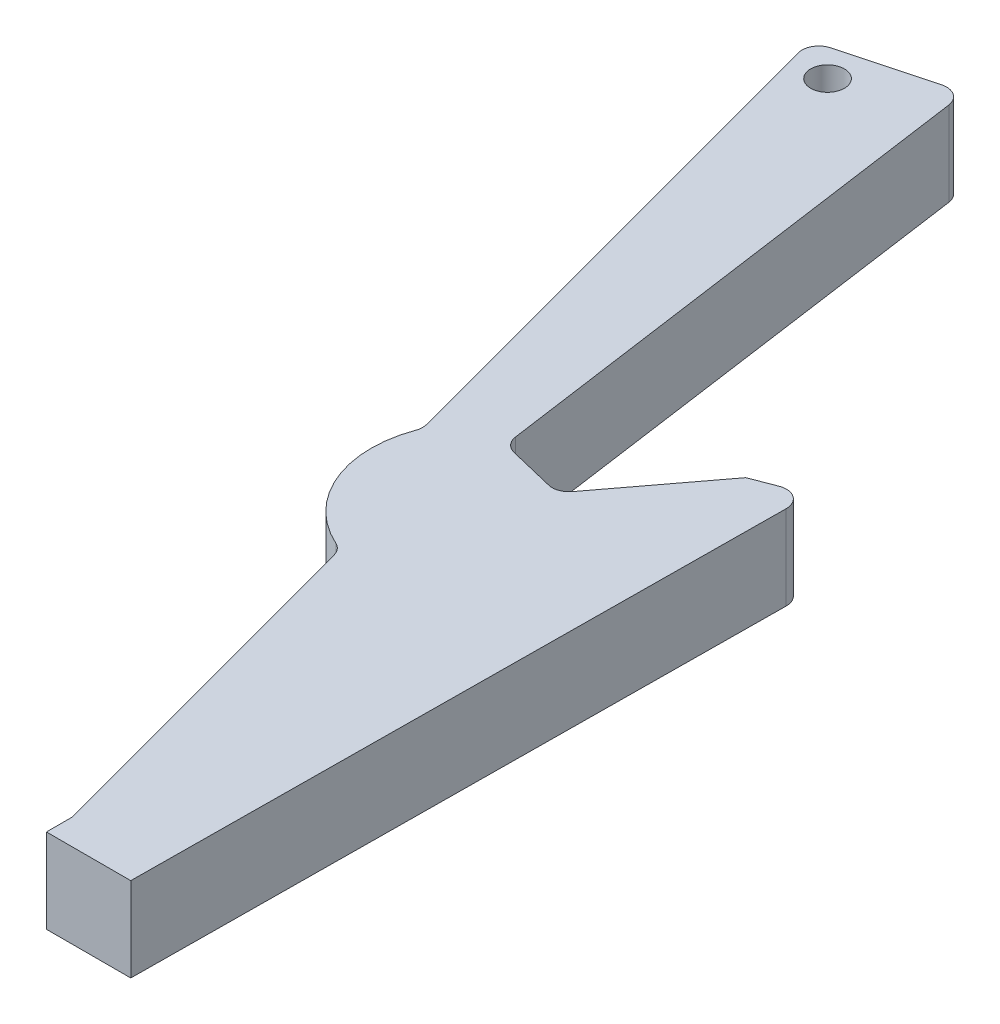
ISO-10303-21;
HEADER;
FILE_DESCRIPTION(('STEP AP214'),'2;1');
FILE_NAME('part.step','',(''),(''),'','','');
FILE_SCHEMA(('AUTOMOTIVE_DESIGN { 1 0 10303 214 1 1 1 1 }'));
ENDSEC;
DATA;
#1=APPLICATION_CONTEXT('core data for automotive mechanical design processes');
#2=APPLICATION_PROTOCOL_DEFINITION('international standard','automotive_design',2000,#1);
#3=PRODUCT_CONTEXT('',#1,'mechanical');
#4=PRODUCT('Part','Part','',(#3));
#5=PRODUCT_RELATED_PRODUCT_CATEGORY('part','',(#4));
#6=PRODUCT_DEFINITION_FORMATION('','',#4);
#7=PRODUCT_DEFINITION_CONTEXT('part definition',#1,'design');
#8=PRODUCT_DEFINITION('design','',#6,#7);
#9=PRODUCT_DEFINITION_SHAPE('','',#8);
#10=(LENGTH_UNIT() NAMED_UNIT(*) SI_UNIT(.MILLI.,.METRE.));
#11=(NAMED_UNIT(*) PLANE_ANGLE_UNIT() SI_UNIT($,.RADIAN.));
#12=(NAMED_UNIT(*) SI_UNIT($,.STERADIAN.) SOLID_ANGLE_UNIT());
#13=UNCERTAINTY_MEASURE_WITH_UNIT(LENGTH_MEASURE(1.E-05),#10,'distance_accuracy_value','');
#14=(GEOMETRIC_REPRESENTATION_CONTEXT(3) GLOBAL_UNCERTAINTY_ASSIGNED_CONTEXT((#13)) GLOBAL_UNIT_ASSIGNED_CONTEXT((#10,
#11,#12)) REPRESENTATION_CONTEXT('',''));
#15=CARTESIAN_POINT('',(0.,0.,0.));
#16=DIRECTION('',(0.,0.,1.));
#17=DIRECTION('',(1.,0.,0.));
#18=AXIS2_PLACEMENT_3D('',#15,#16,#17);
#19=CARTESIAN_POINT('',(4.49028515077188,10.,-86.0590658013581));
#20=DIRECTION('',(-0.99026806874157,0.,0.13917310096007));
#21=DIRECTION('',(0.13917310096007,0.,0.99026806874157));
#22=AXIS2_PLACEMENT_3D('',#19,#20,#21);
#23=PLANE('',#22);
#24=DIRECTION('',(-0.13917310096007,0.,-0.99026806874157));
#25=VECTOR('',#24,1.);
#26=CARTESIAN_POINT('',(4.49028515077188,10.,-86.0590658013581));
#27=LINE('',#26,#25);
#28=CARTESIAN_POINT('',(13.2081072924992,10.,-24.028538088983));
#29=VERTEX_POINT('',#28);
#30=CARTESIAN_POINT('',(4.80489830026733,10.,-83.8204769231744));
#31=VERTEX_POINT('',#30);
#32=EDGE_CURVE('E261',#29,#31,#27,.T.);
#33=ORIENTED_EDGE('',*,*,#32,.F.);
#34=DIRECTION('',(0.,-1.,0.));
#35=VECTOR('',#34,1.);
#36=CARTESIAN_POINT('',(13.2081072924992,0.,-24.028538088983));
#37=LINE('',#36,#35);
#38=CARTESIAN_POINT('',(13.2081072924992,0.,-24.028538088983));
#39=VERTEX_POINT('',#38);
#40=EDGE_CURVE('E290',#29,#39,#37,.T.);
#41=ORIENTED_EDGE('',*,*,#40,.T.);
#42=DIRECTION('',(-0.13917310096007,0.,-0.99026806874157));
#43=VECTOR('',#42,1.);
#44=CARTESIAN_POINT('',(4.49028515077188,0.,-86.0590658013581));
#45=LINE('',#44,#43);
#46=CARTESIAN_POINT('',(4.80489830026733,0.,-83.8204769231744));
#47=VERTEX_POINT('',#46);
#48=EDGE_CURVE('E222',#39,#47,#45,.T.);
#49=ORIENTED_EDGE('',*,*,#48,.T.);
#50=DIRECTION('',(0.,-1.,0.));
#51=VECTOR('',#50,1.);
#52=CARTESIAN_POINT('',(4.80489830026733,10.,-83.8204769231744));
#53=LINE('',#52,#51);
#54=EDGE_CURVE('E287',#47,#31,#53,.F.);
#55=ORIENTED_EDGE('',*,*,#54,.T.);
#56=EDGE_LOOP('',(#33,#41,#49,#55));
#57=FACE_BOUND('',#56,.T.);
#58=ADVANCED_FACE('F45',(#57),#23,.F.);
#59=CARTESIAN_POINT('',(4.49028515077188,10.,-86.0590658013581));
#60=DIRECTION('',(0.258819045102522,0.,0.965925826289068));
#61=DIRECTION('',(0.965925826289068,0.,-0.258819045102522));
#62=AXIS2_PLACEMENT_3D('',#59,#60,#61);
#63=PLANE('',#62);
#64=DIRECTION('',(-0.965925826289068,0.,0.258819045102522));
#65=VECTOR('',#64,1.);
#66=CARTESIAN_POINT('',(4.49028515077188,10.,-86.0590658013581));
#67=LINE('',#66,#65);
#68=CARTESIAN_POINT('',(2.30672407257914,10.,-85.4739823738324));
#69=VERTEX_POINT('',#68);
#70=CARTESIAN_POINT('',(-8.066750590986,10.,-82.6944182150254));
#71=VERTEX_POINT('',#70);
#72=EDGE_CURVE('E378',#69,#71,#67,.T.);
#73=ORIENTED_EDGE('',*,*,#72,.F.);
#74=DIRECTION('',(0.,-1.,0.));
#75=VECTOR('',#74,1.);
#76=CARTESIAN_POINT('',(2.30672407257914,10.,-85.4739823738324));
#77=LINE('',#76,#75);
#78=CARTESIAN_POINT('',(2.30672407257914,0.,-85.4739823738324));
#79=VERTEX_POINT('',#78);
#80=EDGE_CURVE('E330',#69,#79,#77,.T.);
#81=ORIENTED_EDGE('',*,*,#80,.T.);
#82=DIRECTION('',(-0.965925826289068,0.,0.258819045102522));
#83=VECTOR('',#82,1.);
#84=CARTESIAN_POINT('',(4.49028515077188,0.,-86.0590658013581));
#85=LINE('',#84,#83);
#86=CARTESIAN_POINT('',(-8.066750590986,0.,-82.6944182150254));
#87=VERTEX_POINT('',#86);
#88=EDGE_CURVE('E226',#79,#87,#85,.T.);
#89=ORIENTED_EDGE('',*,*,#88,.T.);
#90=DIRECTION('',(0.,-1.,0.));
#91=VECTOR('',#90,1.);
#92=CARTESIAN_POINT('',(-8.066750590986,10.,-82.6944182150254));
#93=LINE('',#92,#91);
#94=EDGE_CURVE('E61',#87,#71,#93,.F.);
#95=ORIENTED_EDGE('',*,*,#94,.T.);
#96=EDGE_LOOP('',(#73,#81,#89,#95));
#97=FACE_BOUND('',#96,.T.);
#98=ADVANCED_FACE('F424',(#97),#63,.F.);
#99=CARTESIAN_POINT('',(-9.99860224356414,10.,-82.1767801248203));
#100=DIRECTION('',(0.965925826289067,0.,-0.258819045102525));
#101=DIRECTION('',(-0.258819045102525,0.,-0.965925826289067));
#102=AXIS2_PLACEMENT_3D('',#99,#100,#101);
#103=PLANE('',#102);
#104=DIRECTION('',(0.258819045102525,0.,0.965925826289067));
#105=VECTOR('',#104,1.);
#106=CARTESIAN_POINT('',(-9.99860224356414,0.,-82.1767801248203));
#107=LINE('',#106,#105);
#108=CARTESIAN_POINT('',(-9.48096415335909,0.,-80.2449284722422));
#109=VERTEX_POINT('',#108);
#110=CARTESIAN_POINT('',(6.65382916204913,0.,-20.0290600495171));
#111=VERTEX_POINT('',#110);
#112=EDGE_CURVE('E230',#109,#111,#107,.T.);
#113=ORIENTED_EDGE('',*,*,#112,.T.);
#114=DIRECTION('',(0.,1.,0.));
#115=VECTOR('',#114,1.);
#116=CARTESIAN_POINT('',(6.65382916204914,10.,-20.0290600495171));
#117=LINE('',#116,#115);
#118=CARTESIAN_POINT('',(6.65382916204913,10.,-20.0290600495171));
#119=VERTEX_POINT('',#118);
#120=EDGE_CURVE('E284',#111,#119,#117,.T.);
#121=ORIENTED_EDGE('',*,*,#120,.T.);
#122=DIRECTION('',(0.258819045102525,0.,0.965925826289067));
#123=VECTOR('',#122,1.);
#124=CARTESIAN_POINT('',(-9.99860224356414,10.,-82.1767801248203));
#125=LINE('',#124,#123);
#126=CARTESIAN_POINT('',(-9.48096415335909,10.,-80.2449284722422));
#127=VERTEX_POINT('',#126);
#128=EDGE_CURVE('E381',#127,#119,#125,.T.);
#129=ORIENTED_EDGE('',*,*,#128,.F.);
#130=DIRECTION('',(0.,-1.,0.));
#131=VECTOR('',#130,1.);
#132=CARTESIAN_POINT('',(-9.48096415335909,10.,-80.2449284722422));
#133=LINE('',#132,#131);
#134=EDGE_CURVE('E280',#127,#109,#133,.T.);
#135=ORIENTED_EDGE('',*,*,#134,.T.);
#136=EDGE_LOOP('',(#113,#121,#129,#135));
#137=FACE_BOUND('',#136,.T.);
#138=ADVANCED_FACE('F430',(#137),#103,.F.);
#139=CARTESIAN_POINT('',(18.7978009355206,10.,-14.3276786324609));
#140=DIRECTION('',(0.,-1.,0.));
#141=DIRECTION('',(0.,0.,-1.));
#142=AXIS2_PLACEMENT_3D('',#139,#140,#141);
#143=CYLINDRICAL_SURFACE('',#142,13.);
#144=CARTESIAN_POINT('',(18.7978009355206,0.,-14.3276786324609));
#145=DIRECTION('',(0.,1.,0.));
#146=DIRECTION('',(0.,0.,1.));
#147=AXIS2_PLACEMENT_3D('',#144,#145,#146);
#148=CIRCLE('',#147,13.);
#149=CARTESIAN_POINT('',(6.59875396627762,0.,-18.8202561823986));
#150=VERTEX_POINT('',#149);
#151=CARTESIAN_POINT('',(13.4555984216238,0.,-2.47605965864496));
#152=VERTEX_POINT('',#151);
#153=EDGE_CURVE('E234',#150,#152,#148,.T.);
#154=ORIENTED_EDGE('',*,*,#153,.T.);
#155=DIRECTION('',(0.,-1.,0.));
#156=VECTOR('',#155,1.);
#157=CARTESIAN_POINT('',(13.4555984216238,10.,-2.47605965864496));
#158=LINE('',#157,#156);
#159=CARTESIAN_POINT('',(13.4555984216238,10.,-2.47605965864496));
#160=VERTEX_POINT('',#159);
#161=EDGE_CURVE('E277',#152,#160,#158,.F.);
#162=ORIENTED_EDGE('',*,*,#161,.T.);
#163=CARTESIAN_POINT('',(18.7978009355206,10.,-14.3276786324609));
#164=DIRECTION('',(0.,1.,0.));
#165=DIRECTION('',(0.,0.,1.));
#166=AXIS2_PLACEMENT_3D('',#163,#164,#165);
#167=CIRCLE('',#166,13.);
#168=CARTESIAN_POINT('',(6.59875396627762,10.,-18.8202561823986));
#169=VERTEX_POINT('',#168);
#170=EDGE_CURVE('E184',#169,#160,#167,.T.);
#171=ORIENTED_EDGE('',*,*,#170,.F.);
#172=DIRECTION('',(0.,-1.,0.));
#173=VECTOR('',#172,1.);
#174=CARTESIAN_POINT('',(6.59875396627762,10.,-18.8202561823986));
#175=LINE('',#174,#173);
#176=EDGE_CURVE('E273',#169,#150,#175,.T.);
#177=ORIENTED_EDGE('',*,*,#176,.T.);
#178=EDGE_LOOP('',(#154,#162,#171,#177));
#179=FACE_BOUND('',#178,.T.);
#180=ADVANCED_FACE('F461',(#179),#143,.T.);
#181=CARTESIAN_POINT('',(25.9560570340894,10.,41.3394942645224));
#182=DIRECTION('',(0.965925826289068,0.,-0.258819045102522));
#183=DIRECTION('',(-0.258819045102522,0.,-0.965925826289068));
#184=AXIS2_PLACEMENT_3D('',#181,#182,#183);
#185=PLANE('',#184);
#186=DIRECTION('',(0.258819045102522,0.,0.965925826289068));
#187=VECTOR('',#186,1.);
#188=CARTESIAN_POINT('',(25.9560570340894,10.,41.3394942645224));
#189=LINE('',#188,#187);
#190=CARTESIAN_POINT('',(14.5655727643716,10.,-1.1703717528783));
#191=VERTEX_POINT('',#190);
#192=CARTESIAN_POINT('',(25.9560570340894,10.,41.3394942645224));
#193=VERTEX_POINT('',#192);
#194=EDGE_CURVE('E170',#191,#193,#189,.T.);
#195=ORIENTED_EDGE('',*,*,#194,.F.);
#196=DIRECTION('',(0.,1.,0.));
#197=VECTOR('',#196,1.);
#198=CARTESIAN_POINT('',(14.5655727643716,0.,-1.17037175287832));
#199=LINE('',#198,#197);
#200=CARTESIAN_POINT('',(14.5655727643716,0.,-1.1703717528783));
#201=VERTEX_POINT('',#200);
#202=EDGE_CURVE('E194',#191,#201,#199,.F.);
#203=ORIENTED_EDGE('',*,*,#202,.T.);
#204=DIRECTION('',(0.258819045102522,0.,0.965925826289068));
#205=VECTOR('',#204,1.);
#206=CARTESIAN_POINT('',(25.9560570340894,0.,41.3394942645224));
#207=LINE('',#206,#205);
#208=CARTESIAN_POINT('',(25.9560570340894,0.,41.3394942645224));
#209=VERTEX_POINT('',#208);
#210=EDGE_CURVE('E190',#201,#209,#207,.T.);
#211=ORIENTED_EDGE('',*,*,#210,.T.);
#212=DIRECTION('',(0.,-1.,0.));
#213=VECTOR('',#212,1.);
#214=CARTESIAN_POINT('',(25.9560570340894,10.,41.3394942645224));
#215=LINE('',#214,#213);
#216=EDGE_CURVE('E187',#193,#209,#215,.T.);
#217=ORIENTED_EDGE('',*,*,#216,.F.);
#218=EDGE_LOOP('',(#195,#203,#211,#217));
#219=FACE_BOUND('',#218,.T.);
#220=ADVANCED_FACE('F188',(#219),#185,.F.);
#221=CARTESIAN_POINT('',(25.9560570340894,10.,44.3394942645224));
#222=DIRECTION('',(1.,0.,0.));
#223=DIRECTION('',(0.,0.,-1.));
#224=AXIS2_PLACEMENT_3D('',#221,#222,#223);
#225=PLANE('',#224);
#226=DIRECTION('',(0.,0.,1.));
#227=VECTOR('',#226,1.);
#228=CARTESIAN_POINT('',(25.9560570340894,0.,44.3394942645224));
#229=LINE('',#228,#227);
#230=CARTESIAN_POINT('',(25.9560570340894,0.,44.3394942645224));
#231=VERTEX_POINT('',#230);
#232=EDGE_CURVE('E240',#209,#231,#229,.T.);
#233=ORIENTED_EDGE('',*,*,#232,.T.);
#234=DIRECTION('',(0.,-1.,0.));
#235=VECTOR('',#234,1.);
#236=CARTESIAN_POINT('',(25.9560570340894,10.,44.3394942645224));
#237=LINE('',#236,#235);
#238=CARTESIAN_POINT('',(25.9560570340894,10.,44.3394942645224));
#239=VERTEX_POINT('',#238);
#240=EDGE_CURVE('E195',#239,#231,#237,.T.);
#241=ORIENTED_EDGE('',*,*,#240,.F.);
#242=DIRECTION('',(0.,0.,1.));
#243=VECTOR('',#242,1.);
#244=CARTESIAN_POINT('',(25.9560570340894,10.,44.3394942645224));
#245=LINE('',#244,#243);
#246=EDGE_CURVE('E175',#193,#239,#245,.T.);
#247=ORIENTED_EDGE('',*,*,#246,.F.);
#248=ORIENTED_EDGE('',*,*,#216,.T.);
#249=EDGE_LOOP('',(#233,#241,#247,#248));
#250=FACE_BOUND('',#249,.T.);
#251=ADVANCED_FACE('F197',(#250),#225,.F.);
#252=CARTESIAN_POINT('',(35.9560570340894,10.,44.3394942645224));
#253=DIRECTION('',(0.,0.,-1.));
#254=DIRECTION('',(-1.,0.,0.));
#255=AXIS2_PLACEMENT_3D('',#252,#253,#254);
#256=PLANE('',#255);
#257=DIRECTION('',(1.,0.,0.));
#258=VECTOR('',#257,1.);
#259=CARTESIAN_POINT('',(35.9560570340894,0.,44.3394942645224));
#260=LINE('',#259,#258);
#261=CARTESIAN_POINT('',(35.9560570340894,0.,44.3394942645224));
#262=VERTEX_POINT('',#261);
#263=EDGE_CURVE('E243',#231,#262,#260,.T.);
#264=ORIENTED_EDGE('',*,*,#263,.T.);
#265=DIRECTION('',(0.,-1.,0.));
#266=VECTOR('',#265,1.);
#267=CARTESIAN_POINT('',(35.9560570340894,10.,44.3394942645224));
#268=LINE('',#267,#266);
#269=CARTESIAN_POINT('',(35.9560570340894,10.,44.3394942645224));
#270=VERTEX_POINT('',#269);
#271=EDGE_CURVE('E265',#270,#262,#268,.T.);
#272=ORIENTED_EDGE('',*,*,#271,.F.);
#273=DIRECTION('',(1.,0.,0.));
#274=VECTOR('',#273,1.);
#275=CARTESIAN_POINT('',(35.9560570340894,10.,44.3394942645224));
#276=LINE('',#275,#274);
#277=EDGE_CURVE('E201',#239,#270,#276,.T.);
#278=ORIENTED_EDGE('',*,*,#277,.F.);
#279=ORIENTED_EDGE('',*,*,#240,.T.);
#280=EDGE_LOOP('',(#264,#272,#278,#279));
#281=FACE_BOUND('',#280,.T.);
#282=ADVANCED_FACE('F401',(#281),#256,.F.);
#283=CARTESIAN_POINT('',(36.6450825246778,10.,-35.6605057354776));
#284=DIRECTION('',(-0.999962911741013,0.,-0.00861249919790591));
#285=DIRECTION('',(-0.00861249919790591,0.,0.999962911741014));
#286=AXIS2_PLACEMENT_3D('',#283,#284,#285);
#287=PLANE('',#286);
#288=DIRECTION('',(0.00861249919790591,0.,-0.999962911741013));
#289=VECTOR('',#288,1.);
#290=CARTESIAN_POINT('',(36.6450825246778,0.,-35.6605057354776));
#291=LINE('',#290,#289);
#292=CARTESIAN_POINT('',(36.6198231144349,0.,-32.7277364155751));
#293=VERTEX_POINT('',#292);
#294=EDGE_CURVE('E246',#262,#293,#291,.T.);
#295=ORIENTED_EDGE('',*,*,#294,.T.);
#296=DIRECTION('',(0.,-1.,0.));
#297=VECTOR('',#296,1.);
#298=CARTESIAN_POINT('',(36.6198231144349,10.,-32.7277364155751));
#299=LINE('',#298,#297);
#300=CARTESIAN_POINT('',(36.6198231144349,10.,-32.7277364155751));
#301=VERTEX_POINT('',#300);
#302=EDGE_CURVE('E317',#293,#301,#299,.F.);
#303=ORIENTED_EDGE('',*,*,#302,.T.);
#304=DIRECTION('',(0.00861249919790591,0.,-0.999962911741013));
#305=VECTOR('',#304,1.);
#306=CARTESIAN_POINT('',(36.6450825246778,10.,-35.6605057354776));
#307=LINE('',#306,#305);
#308=EDGE_CURVE('E204',#270,#301,#307,.T.);
#309=ORIENTED_EDGE('',*,*,#308,.F.);
#310=ORIENTED_EDGE('',*,*,#271,.T.);
#311=EDGE_LOOP('',(#295,#303,#309,#310));
#312=FACE_BOUND('',#311,.T.);
#313=ADVANCED_FACE('F413',(#312),#287,.F.);
#314=CARTESIAN_POINT('',(31.0407715155712,10.,-33.5176809378781));
#315=DIRECTION('',(0.35713746626659,0.,0.934051834851086));
#316=DIRECTION('',(0.934051834851086,0.,-0.35713746626659));
#317=AXIS2_PLACEMENT_3D('',#314,#315,#316);
#318=PLANE('',#317);
#319=DIRECTION('',(-0.934051834851086,0.,0.35713746626659));
#320=VECTOR('',#319,1.);
#321=CARTESIAN_POINT('',(31.0407715155712,10.,-33.5176809378781));
#322=LINE('',#321,#320);
#323=CARTESIAN_POINT('',(33.9056223584197,10.,-34.6130650836731));
#324=VERTEX_POINT('',#323);
#325=CARTESIAN_POINT('',(31.0407715155712,10.,-33.5176809378781));
#326=VERTEX_POINT('',#325);
#327=EDGE_CURVE('E210',#324,#326,#322,.T.);
#328=ORIENTED_EDGE('',*,*,#327,.F.);
#329=DIRECTION('',(0.,-1.,0.));
#330=VECTOR('',#329,1.);
#331=CARTESIAN_POINT('',(33.9056223584197,10.,-34.6130650836731));
#332=LINE('',#331,#330);
#333=CARTESIAN_POINT('',(33.9056223584197,0.,-34.6130650836731));
#334=VERTEX_POINT('',#333);
#335=EDGE_CURVE('E304',#324,#334,#332,.T.);
#336=ORIENTED_EDGE('',*,*,#335,.T.);
#337=DIRECTION('',(-0.934051834851086,0.,0.35713746626659));
#338=VECTOR('',#337,1.);
#339=CARTESIAN_POINT('',(31.0407715155712,0.,-33.5176809378781));
#340=LINE('',#339,#338);
#341=CARTESIAN_POINT('',(31.0407715155712,0.,-33.5176809378781));
#342=VERTEX_POINT('',#341);
#343=EDGE_CURVE('E250',#334,#342,#340,.T.);
#344=ORIENTED_EDGE('',*,*,#343,.T.);
#345=DIRECTION('',(0.,-1.,0.));
#346=VECTOR('',#345,1.);
#347=CARTESIAN_POINT('',(31.0407715155712,10.,-33.5176809378781));
#348=LINE('',#347,#346);
#349=EDGE_CURVE('E221',#326,#342,#348,.T.);
#350=ORIENTED_EDGE('',*,*,#349,.F.);
#351=EDGE_LOOP('',(#328,#336,#344,#350));
#352=FACE_BOUND('',#351,.T.);
#353=ADVANCED_FACE('F412',(#352),#318,.F.);
#354=CARTESIAN_POINT('',(21.3973636122163,10.,-20.7503521644223));
#355=DIRECTION('',(0.797958048340987,0.,0.602712993959682));
#356=DIRECTION('',(0.602712993959682,0.,-0.797958048340987));
#357=AXIS2_PLACEMENT_3D('',#354,#355,#356);
#358=PLANE('',#357);
#359=DIRECTION('',(-0.602712993959682,0.,0.797958048340987));
#360=VECTOR('',#359,1.);
#361=CARTESIAN_POINT('',(21.3973636122163,0.,-20.7503521644223));
#362=LINE('',#361,#360);
#363=CARTESIAN_POINT('',(22.1878187573279,0.,-21.7968702438658));
#364=VERTEX_POINT('',#363);
#365=EDGE_CURVE('E253',#342,#364,#362,.T.);
#366=ORIENTED_EDGE('',*,*,#365,.T.);
#367=DIRECTION('',(0.,-1.,0.));
#368=VECTOR('',#367,1.);
#369=CARTESIAN_POINT('',(22.1878187573279,10.,-21.7968702438658));
#370=LINE('',#369,#368);
#371=CARTESIAN_POINT('',(22.1878187573279,10.,-21.7968702438658));
#372=VERTEX_POINT('',#371);
#373=EDGE_CURVE('E301',#364,#372,#370,.F.);
#374=ORIENTED_EDGE('',*,*,#373,.T.);
#375=DIRECTION('',(-0.602712993959682,0.,0.797958048340987));
#376=VECTOR('',#375,1.);
#377=CARTESIAN_POINT('',(21.3973636122163,10.,-20.7503521644223));
#378=LINE('',#377,#376);
#379=EDGE_CURVE('E213',#326,#372,#378,.T.);
#380=ORIENTED_EDGE('',*,*,#379,.F.);
#381=ORIENTED_EDGE('',*,*,#349,.T.);
#382=EDGE_LOOP('',(#366,#374,#380,#381));
#383=FACE_BOUND('',#382,.T.);
#384=ADVANCED_FACE('F360',(#383),#358,.F.);
#385=CARTESIAN_POINT('',(13.3973636122163,10.,-22.6819094018977));
#386=DIRECTION('',(-0.234700554659464,0.,0.972067718650578));
#387=DIRECTION('',(0.972067718650578,0.,0.234700554659464));
#388=AXIS2_PLACEMENT_3D('',#385,#386,#387);
#389=PLANE('',#388);
#390=DIRECTION('',(-0.972067718650578,0.,-0.234700554659464));
#391=VECTOR('',#390,1.);
#392=CARTESIAN_POINT('',(13.3973636122163,0.,-22.6819094018977));
#393=LINE('',#392,#391);
#394=CARTESIAN_POINT('',(20.122501551327,0.,-21.058160794484));
#395=VERTEX_POINT('',#394);
#396=CARTESIAN_POINT('',(14.7192423206634,0.,-22.362748853602));
#397=VERTEX_POINT('',#396);
#398=EDGE_CURVE('E257',#395,#397,#393,.T.);
#399=ORIENTED_EDGE('',*,*,#398,.T.);
#400=DIRECTION('',(0.,-1.,0.));
#401=VECTOR('',#400,1.);
#402=CARTESIAN_POINT('',(14.7192423206634,10.,-22.362748853602));
#403=LINE('',#402,#401);
#404=CARTESIAN_POINT('',(14.7192423206634,10.,-22.362748853602));
#405=VERTEX_POINT('',#404);
#406=EDGE_CURVE('E298',#397,#405,#403,.F.);
#407=ORIENTED_EDGE('',*,*,#406,.T.);
#408=DIRECTION('',(-0.972067718650578,0.,-0.234700554659464));
#409=VECTOR('',#408,1.);
#410=CARTESIAN_POINT('',(13.3973636122163,10.,-22.6819094018977));
#411=LINE('',#410,#409);
#412=CARTESIAN_POINT('',(20.122501551327,10.,-21.058160794484));
#413=VERTEX_POINT('',#412);
#414=EDGE_CURVE('E217',#413,#405,#411,.T.);
#415=ORIENTED_EDGE('',*,*,#414,.F.);
#416=DIRECTION('',(0.,-1.,0.));
#417=VECTOR('',#416,1.);
#418=CARTESIAN_POINT('',(20.122501551327,0.,-21.058160794484));
#419=LINE('',#418,#417);
#420=EDGE_CURVE('E294',#413,#395,#419,.T.);
#421=ORIENTED_EDGE('',*,*,#420,.T.);
#422=EDGE_LOOP('',(#399,#407,#415,#421));
#423=FACE_BOUND('',#422,.T.);
#424=ADVANCED_FACE('F368',(#423),#389,.F.);
#425=CARTESIAN_POINT('',(18.7978009355206,10.,-14.3276786324609));
#426=DIRECTION('',(0.,1.,0.));
#427=DIRECTION('',(0.,0.,1.));
#428=AXIS2_PLACEMENT_3D('',#425,#426,#427);
#429=PLANE('',#428);
#430=CARTESIAN_POINT('',(-5.09962275799777,10.,-79.3483530000741));
#431=DIRECTION('',(0.,1.,0.));
#432=DIRECTION('',(0.,0.,1.));
#433=AXIS2_PLACEMENT_3D('',#430,#431,#432);
#434=CIRCLE('',#433,2.);
#435=CARTESIAN_POINT('',(-5.09962275799777,10.,-77.3483530000741));
#436=VERTEX_POINT('',#435);
#437=EDGE_CURVE('E384',#436,#436,#434,.T.);
#438=ORIENTED_EDGE('',*,*,#437,.F.);
#439=EDGE_LOOP('',(#438));
#440=FACE_BOUND('',#439,.T.);
#441=ORIENTED_EDGE('',*,*,#308,.T.);
#442=CARTESIAN_POINT('',(34.6198972909529,10.,-32.7449614139709));
#443=DIRECTION('',(0.,1.,0.));
#444=DIRECTION('',(0.,0.,1.));
#445=AXIS2_PLACEMENT_3D('',#442,#443,#444);
#446=CIRCLE('',#445,2.);
#447=EDGE_CURVE('E325',#301,#324,#446,.T.);
#448=ORIENTED_EDGE('',*,*,#447,.T.);
#449=ORIENTED_EDGE('',*,*,#327,.T.);
#450=ORIENTED_EDGE('',*,*,#379,.T.);
#451=CARTESIAN_POINT('',(20.5919026606459,10.,-23.0022962317851));
#452=DIRECTION('',(0.,1.,0.));
#453=DIRECTION('',(0.,0.,1.));
#454=AXIS2_PLACEMENT_3D('',#451,#452,#453);
#455=CIRCLE('',#454,2.);
#456=EDGE_CURVE('E11',#372,#413,#455,.F.);
#457=ORIENTED_EDGE('',*,*,#456,.T.);
#458=ORIENTED_EDGE('',*,*,#414,.T.);
#459=CARTESIAN_POINT('',(15.1886434299823,10.,-24.3068842909031));
#460=DIRECTION('',(0.,1.,0.));
#461=DIRECTION('',(0.,0.,1.));
#462=AXIS2_PLACEMENT_3D('',#459,#460,#461);
#463=CIRCLE('',#462,2.);
#464=EDGE_CURVE('E348',#405,#29,#463,.F.);
#465=ORIENTED_EDGE('',*,*,#464,.T.);
#466=ORIENTED_EDGE('',*,*,#32,.T.);
#467=CARTESIAN_POINT('',(2.82436216278419,10.,-83.5421307212542));
#468=DIRECTION('',(0.,1.,0.));
#469=DIRECTION('',(0.,0.,1.));
#470=AXIS2_PLACEMENT_3D('',#467,#468,#469);
#471=CIRCLE('',#470,2.);
#472=EDGE_CURVE('E68',#31,#69,#471,.T.);
#473=ORIENTED_EDGE('',*,*,#472,.T.);
#474=ORIENTED_EDGE('',*,*,#72,.T.);
#475=CARTESIAN_POINT('',(-7.54911250078095,10.,-80.7625665624472));
#476=DIRECTION('',(0.,1.,0.));
#477=DIRECTION('',(0.,0.,1.));
#478=AXIS2_PLACEMENT_3D('',#475,#476,#477);
#479=CIRCLE('',#478,2.);
#480=EDGE_CURVE('E320',#71,#127,#479,.T.);
#481=ORIENTED_EDGE('',*,*,#480,.T.);
#482=ORIENTED_EDGE('',*,*,#128,.T.);
#483=CARTESIAN_POINT('',(4.721977509471,10.,-19.511421959312));
#484=DIRECTION('',(0.,1.,0.));
#485=DIRECTION('',(0.,0.,1.));
#486=AXIS2_PLACEMENT_3D('',#483,#484,#485);
#487=CIRCLE('',#486,2.);
#488=EDGE_CURVE('E342',#119,#169,#487,.F.);
#489=ORIENTED_EDGE('',*,*,#488,.T.);
#490=ORIENTED_EDGE('',*,*,#170,.T.);
#491=CARTESIAN_POINT('',(12.6337211117935,10.,-0.652733662673275));
#492=DIRECTION('',(0.,1.,0.));
#493=DIRECTION('',(0.,0.,1.));
#494=AXIS2_PLACEMENT_3D('',#491,#492,#493);
#495=CIRCLE('',#494,2.);
#496=EDGE_CURVE('E179',#160,#191,#495,.F.);
#497=ORIENTED_EDGE('',*,*,#496,.T.);
#498=ORIENTED_EDGE('',*,*,#194,.T.);
#499=ORIENTED_EDGE('',*,*,#246,.T.);
#500=ORIENTED_EDGE('',*,*,#277,.T.);
#501=EDGE_LOOP('',(#441,#448,#449,#450,#457,#458,#465,#466,#473,#474,#481,#482,#489,#490,#497,
#498,#499,#500));
#502=FACE_BOUND('',#501,.T.);
#503=ADVANCED_FACE('F173',(#440,#502),#429,.T.);
#504=CARTESIAN_POINT('',(18.7978009355206,0.,-14.3276786324609));
#505=DIRECTION('',(0.,1.,0.));
#506=DIRECTION('',(0.,0.,1.));
#507=AXIS2_PLACEMENT_3D('',#504,#505,#506);
#508=PLANE('',#507);
#509=CARTESIAN_POINT('',(-5.09962275799777,0.,-79.3483530000741));
#510=DIRECTION('',(0.,1.,0.));
#511=DIRECTION('',(0.,0.,1.));
#512=AXIS2_PLACEMENT_3D('',#509,#510,#511);
#513=CIRCLE('',#512,2.);
#514=CARTESIAN_POINT('',(-5.09962275799777,0.,-77.3483530000741));
#515=VERTEX_POINT('',#514);
#516=EDGE_CURVE('E227',#515,#515,#513,.T.);
#517=ORIENTED_EDGE('',*,*,#516,.T.);
#518=EDGE_LOOP('',(#517));
#519=FACE_BOUND('',#518,.T.);
#520=ORIENTED_EDGE('',*,*,#343,.F.);
#521=CARTESIAN_POINT('',(34.6198972909529,0.,-32.7449614139709));
#522=DIRECTION('',(0.,1.,0.));
#523=DIRECTION('',(0.,0.,1.));
#524=AXIS2_PLACEMENT_3D('',#521,#522,#523);
#525=CIRCLE('',#524,2.);
#526=EDGE_CURVE('E314',#334,#293,#525,.F.);
#527=ORIENTED_EDGE('',*,*,#526,.T.);
#528=ORIENTED_EDGE('',*,*,#294,.F.);
#529=ORIENTED_EDGE('',*,*,#263,.F.);
#530=ORIENTED_EDGE('',*,*,#232,.F.);
#531=ORIENTED_EDGE('',*,*,#210,.F.);
#532=CARTESIAN_POINT('',(12.6337211117935,0.,-0.652733662673275));
#533=DIRECTION('',(0.,1.,0.));
#534=DIRECTION('',(0.,0.,1.));
#535=AXIS2_PLACEMENT_3D('',#532,#533,#534);
#536=CIRCLE('',#535,2.);
#537=EDGE_CURVE('E334',#201,#152,#536,.T.);
#538=ORIENTED_EDGE('',*,*,#537,.T.);
#539=ORIENTED_EDGE('',*,*,#153,.F.);
#540=CARTESIAN_POINT('',(4.721977509471,0.,-19.511421959312));
#541=DIRECTION('',(0.,1.,0.));
#542=DIRECTION('',(0.,0.,1.));
#543=AXIS2_PLACEMENT_3D('',#540,#541,#542);
#544=CIRCLE('',#543,2.);
#545=EDGE_CURVE('E339',#150,#111,#544,.T.);
#546=ORIENTED_EDGE('',*,*,#545,.T.);
#547=ORIENTED_EDGE('',*,*,#112,.F.);
#548=CARTESIAN_POINT('',(-7.54911250078095,0.,-80.7625665624472));
#549=DIRECTION('',(0.,1.,0.));
#550=DIRECTION('',(0.,0.,1.));
#551=AXIS2_PLACEMENT_3D('',#548,#549,#550);
#552=CIRCLE('',#551,2.);
#553=EDGE_CURVE('E308',#109,#87,#552,.F.);
#554=ORIENTED_EDGE('',*,*,#553,.T.);
#555=ORIENTED_EDGE('',*,*,#88,.F.);
#556=CARTESIAN_POINT('',(2.82436216278419,0.,-83.5421307212542));
#557=DIRECTION('',(0.,1.,0.));
#558=DIRECTION('',(0.,0.,1.));
#559=AXIS2_PLACEMENT_3D('',#556,#557,#558);
#560=CIRCLE('',#559,2.);
#561=EDGE_CURVE('E311',#79,#47,#560,.F.);
#562=ORIENTED_EDGE('',*,*,#561,.T.);
#563=ORIENTED_EDGE('',*,*,#48,.F.);
#564=CARTESIAN_POINT('',(15.1886434299823,0.,-24.3068842909031));
#565=DIRECTION('',(0.,1.,0.));
#566=DIRECTION('',(0.,0.,1.));
#567=AXIS2_PLACEMENT_3D('',#564,#565,#566);
#568=CIRCLE('',#567,2.);
#569=EDGE_CURVE('E345',#39,#397,#568,.T.);
#570=ORIENTED_EDGE('',*,*,#569,.T.);
#571=ORIENTED_EDGE('',*,*,#398,.F.);
#572=CARTESIAN_POINT('',(20.5919026606459,0.,-23.0022962317851));
#573=DIRECTION('',(0.,1.,0.));
#574=DIRECTION('',(0.,0.,1.));
#575=AXIS2_PLACEMENT_3D('',#572,#573,#574);
#576=CIRCLE('',#575,2.);
#577=EDGE_CURVE('E54',#395,#364,#576,.T.);
#578=ORIENTED_EDGE('',*,*,#577,.T.);
#579=ORIENTED_EDGE('',*,*,#365,.F.);
#580=EDGE_LOOP('',(#520,#527,#528,#529,#530,#531,#538,#539,#546,#547,#554,#555,#562,#563,#570,
#571,#578,#579));
#581=FACE_BOUND('',#580,.T.);
#582=ADVANCED_FACE('F355',(#519,#581),#508,.F.);
#583=CARTESIAN_POINT('',(-5.09962275799777,0.,-79.3483530000741));
#584=DIRECTION('',(0.,1.,0.));
#585=DIRECTION('',(0.,0.,1.));
#586=AXIS2_PLACEMENT_3D('',#583,#584,#585);
#587=CYLINDRICAL_SURFACE('',#586,2.);
#588=ORIENTED_EDGE('',*,*,#516,.F.);
#589=EDGE_LOOP('',(#588));
#590=FACE_BOUND('',#589,.T.);
#591=ORIENTED_EDGE('',*,*,#437,.T.);
#592=EDGE_LOOP('',(#591));
#593=FACE_BOUND('',#592,.T.);
#594=ADVANCED_FACE('F437',(#590,#593),#587,.F.);
#595=CARTESIAN_POINT('',(12.6337211117935,10.,-0.652733662673275));
#596=DIRECTION('',(0.,-1.,0.));
#597=DIRECTION('',(0.,0.,-1.));
#598=AXIS2_PLACEMENT_3D('',#595,#596,#597);
#599=CYLINDRICAL_SURFACE('',#598,2.);
#600=ORIENTED_EDGE('',*,*,#496,.F.);
#601=ORIENTED_EDGE('',*,*,#161,.F.);
#602=ORIENTED_EDGE('',*,*,#537,.F.);
#603=ORIENTED_EDGE('',*,*,#202,.F.);
#604=EDGE_LOOP('',(#600,#601,#602,#603));
#605=FACE_BOUND('',#604,.T.);
#606=ADVANCED_FACE('F396',(#605),#599,.F.);
#607=CARTESIAN_POINT('',(4.721977509471,10.,-19.511421959312));
#608=DIRECTION('',(0.,-1.,0.));
#609=DIRECTION('',(0.,0.,-1.));
#610=AXIS2_PLACEMENT_3D('',#607,#608,#609);
#611=CYLINDRICAL_SURFACE('',#610,2.);
#612=ORIENTED_EDGE('',*,*,#488,.F.);
#613=ORIENTED_EDGE('',*,*,#120,.F.);
#614=ORIENTED_EDGE('',*,*,#545,.F.);
#615=ORIENTED_EDGE('',*,*,#176,.F.);
#616=EDGE_LOOP('',(#612,#613,#614,#615));
#617=FACE_BOUND('',#616,.T.);
#618=ADVANCED_FACE('F436',(#617),#611,.F.);
#619=CARTESIAN_POINT('',(15.1886434299823,10.,-24.3068842909031));
#620=DIRECTION('',(0.,1.,0.));
#621=DIRECTION('',(0.,0.,1.));
#622=AXIS2_PLACEMENT_3D('',#619,#620,#621);
#623=CYLINDRICAL_SURFACE('',#622,2.);
#624=ORIENTED_EDGE('',*,*,#464,.F.);
#625=ORIENTED_EDGE('',*,*,#406,.F.);
#626=ORIENTED_EDGE('',*,*,#569,.F.);
#627=ORIENTED_EDGE('',*,*,#40,.F.);
#628=EDGE_LOOP('',(#624,#625,#626,#627));
#629=FACE_BOUND('',#628,.T.);
#630=ADVANCED_FACE('F371',(#629),#623,.F.);
#631=CARTESIAN_POINT('',(20.5919026606459,10.,-23.0022962317851));
#632=DIRECTION('',(0.,1.,0.));
#633=DIRECTION('',(0.,0.,1.));
#634=AXIS2_PLACEMENT_3D('',#631,#632,#633);
#635=CYLINDRICAL_SURFACE('',#634,2.);
#636=ORIENTED_EDGE('',*,*,#456,.F.);
#637=ORIENTED_EDGE('',*,*,#373,.F.);
#638=ORIENTED_EDGE('',*,*,#577,.F.);
#639=ORIENTED_EDGE('',*,*,#420,.F.);
#640=EDGE_LOOP('',(#636,#637,#638,#639));
#641=FACE_BOUND('',#640,.T.);
#642=ADVANCED_FACE('F364',(#641),#635,.F.);
#643=CARTESIAN_POINT('',(34.6198972909529,10.,-32.7449614139709));
#644=DIRECTION('',(0.,-1.,0.));
#645=DIRECTION('',(0.,0.,-1.));
#646=AXIS2_PLACEMENT_3D('',#643,#644,#645);
#647=CYLINDRICAL_SURFACE('',#646,2.);
#648=ORIENTED_EDGE('',*,*,#447,.F.);
#649=ORIENTED_EDGE('',*,*,#302,.F.);
#650=ORIENTED_EDGE('',*,*,#526,.F.);
#651=ORIENTED_EDGE('',*,*,#335,.F.);
#652=EDGE_LOOP('',(#648,#649,#650,#651));
#653=FACE_BOUND('',#652,.T.);
#654=ADVANCED_FACE('F410',(#653),#647,.T.);
#655=CARTESIAN_POINT('',(2.82436216278419,10.,-83.5421307212542));
#656=DIRECTION('',(0.,-1.,0.));
#657=DIRECTION('',(0.,0.,-1.));
#658=AXIS2_PLACEMENT_3D('',#655,#656,#657);
#659=CYLINDRICAL_SURFACE('',#658,2.);
#660=ORIENTED_EDGE('',*,*,#472,.F.);
#661=ORIENTED_EDGE('',*,*,#54,.F.);
#662=ORIENTED_EDGE('',*,*,#561,.F.);
#663=ORIENTED_EDGE('',*,*,#80,.F.);
#664=EDGE_LOOP('',(#660,#661,#662,#663));
#665=FACE_BOUND('',#664,.T.);
#666=ADVANCED_FACE('F446',(#665),#659,.T.);
#667=CARTESIAN_POINT('',(-7.54911250078095,10.,-80.7625665624472));
#668=DIRECTION('',(0.,-1.,0.));
#669=DIRECTION('',(0.,0.,-1.));
#670=AXIS2_PLACEMENT_3D('',#667,#668,#669);
#671=CYLINDRICAL_SURFACE('',#670,2.);
#672=ORIENTED_EDGE('',*,*,#480,.F.);
#673=ORIENTED_EDGE('',*,*,#94,.F.);
#674=ORIENTED_EDGE('',*,*,#553,.F.);
#675=ORIENTED_EDGE('',*,*,#134,.F.);
#676=EDGE_LOOP('',(#672,#673,#674,#675));
#677=FACE_BOUND('',#676,.T.);
#678=ADVANCED_FACE('F47',(#677),#671,.T.);
#679=CLOSED_SHELL('',(#58,#98,#138,#180,#220,#251,#282,#313,#353,#384,#424,#503,#582,#594,#606,
#618,#630,#642,#654,#666,#678));
#680=MANIFOLD_SOLID_BREP('B2',#679);
#681=ADVANCED_BREP_SHAPE_REPRESENTATION('',(#18,#680),#14);
#682=SHAPE_DEFINITION_REPRESENTATION(#9,#681);
ENDSEC;
END-ISO-10303-21;
